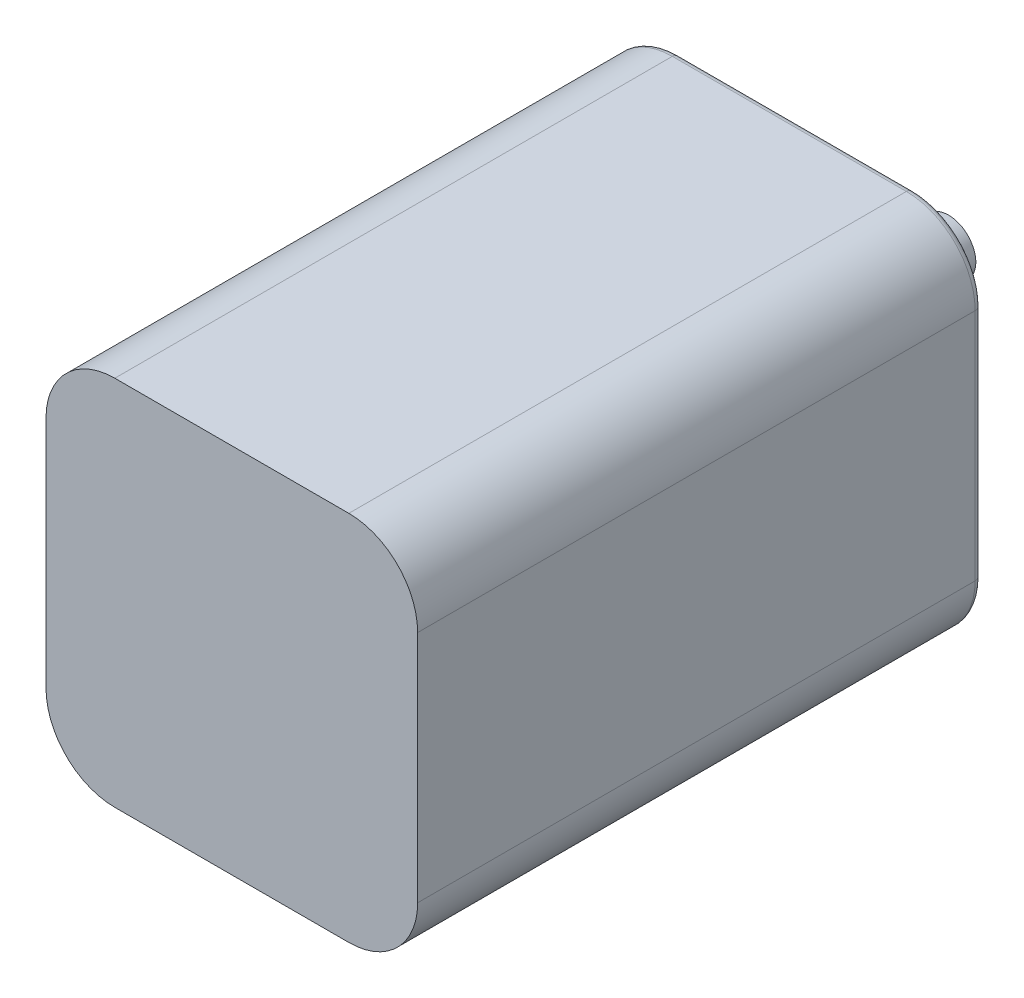
ISO-10303-21;
HEADER;
FILE_DESCRIPTION(('STEP AP214'),'2;1');
FILE_NAME('part.step','',(''),(''),'','','');
FILE_SCHEMA(('AUTOMOTIVE_DESIGN { 1 0 10303 214 1 1 1 1 }'));
ENDSEC;
DATA;
#1=APPLICATION_CONTEXT('core data for automotive mechanical design processes');
#2=APPLICATION_PROTOCOL_DEFINITION('international standard','automotive_design',2000,#1);
#3=PRODUCT_CONTEXT('',#1,'mechanical');
#4=PRODUCT('Part','Part','',(#3));
#5=PRODUCT_RELATED_PRODUCT_CATEGORY('part','',(#4));
#6=PRODUCT_DEFINITION_FORMATION('','',#4);
#7=PRODUCT_DEFINITION_CONTEXT('part definition',#1,'design');
#8=PRODUCT_DEFINITION('design','',#6,#7);
#9=PRODUCT_DEFINITION_SHAPE('','',#8);
#10=(LENGTH_UNIT() NAMED_UNIT(*) SI_UNIT(.MILLI.,.METRE.));
#11=(NAMED_UNIT(*) PLANE_ANGLE_UNIT() SI_UNIT($,.RADIAN.));
#12=(NAMED_UNIT(*) SI_UNIT($,.STERADIAN.) SOLID_ANGLE_UNIT());
#13=UNCERTAINTY_MEASURE_WITH_UNIT(LENGTH_MEASURE(1.E-05),#10,'distance_accuracy_value','');
#14=(GEOMETRIC_REPRESENTATION_CONTEXT(3) GLOBAL_UNCERTAINTY_ASSIGNED_CONTEXT((#13)) GLOBAL_UNIT_ASSIGNED_CONTEXT((#10,
#11,#12)) REPRESENTATION_CONTEXT('',''));
#15=CARTESIAN_POINT('',(0.,0.,0.));
#16=DIRECTION('',(0.,0.,1.));
#17=DIRECTION('',(1.,0.,0.));
#18=AXIS2_PLACEMENT_3D('',#15,#16,#17);
#19=CARTESIAN_POINT('',(34.29,-34.29,104.14));
#20=DIRECTION('',(-1.,0.,0.));
#21=DIRECTION('',(0.,0.,1.));
#22=AXIS2_PLACEMENT_3D('',#19,#20,#21);
#23=PLANE('',#22);
#24=DIRECTION('',(0.,0.,-1.));
#25=VECTOR('',#24,1.);
#26=CARTESIAN_POINT('',(34.29,-21.59,104.14));
#27=LINE('',#26,#25);
#28=CARTESIAN_POINT('',(34.29,-21.59,104.14));
#29=VERTEX_POINT('',#28);
#30=CARTESIAN_POINT('',(34.29,-21.59,1.26999999999999));
#31=VERTEX_POINT('',#30);
#32=EDGE_CURVE('E300',#29,#31,#27,.T.);
#33=ORIENTED_EDGE('',*,*,#32,.T.);
#34=DIRECTION('',(0.,1.,0.));
#35=VECTOR('',#34,1.);
#36=CARTESIAN_POINT('',(34.29,21.59,1.26999999999999));
#37=LINE('',#36,#35);
#38=CARTESIAN_POINT('',(34.29,21.59,1.26999999999999));
#39=VERTEX_POINT('',#38);
#40=EDGE_CURVE('E351',#31,#39,#37,.T.);
#41=ORIENTED_EDGE('',*,*,#40,.T.);
#42=DIRECTION('',(0.,0.,-1.));
#43=VECTOR('',#42,1.);
#44=CARTESIAN_POINT('',(34.29,21.59,104.14));
#45=LINE('',#44,#43);
#46=CARTESIAN_POINT('',(34.29,21.59,104.14));
#47=VERTEX_POINT('',#46);
#48=EDGE_CURVE('E303',#39,#47,#45,.F.);
#49=ORIENTED_EDGE('',*,*,#48,.T.);
#50=DIRECTION('',(0.,1.,0.));
#51=VECTOR('',#50,1.);
#52=CARTESIAN_POINT('',(34.29,-34.29,104.14));
#53=LINE('',#52,#51);
#54=EDGE_CURVE('E256',#29,#47,#53,.T.);
#55=ORIENTED_EDGE('',*,*,#54,.F.);
#56=EDGE_LOOP('',(#33,#41,#49,#55));
#57=FACE_BOUND('',#56,.T.);
#58=ADVANCED_FACE('F45',(#57),#23,.F.);
#59=CARTESIAN_POINT('',(-34.29,34.29,104.14));
#60=DIRECTION('',(0.,-1.,0.));
#61=DIRECTION('',(0.,0.,-1.));
#62=AXIS2_PLACEMENT_3D('',#59,#60,#61);
#63=PLANE('',#62);
#64=DIRECTION('',(0.,0.,-1.));
#65=VECTOR('',#64,1.);
#66=CARTESIAN_POINT('',(21.59,34.29,104.14));
#67=LINE('',#66,#65);
#68=CARTESIAN_POINT('',(21.59,34.29,104.14));
#69=VERTEX_POINT('',#68);
#70=CARTESIAN_POINT('',(21.59,34.29,1.26999999999999));
#71=VERTEX_POINT('',#70);
#72=EDGE_CURVE('E287',#69,#71,#67,.T.);
#73=ORIENTED_EDGE('',*,*,#72,.T.);
#74=DIRECTION('',(-1.,0.,0.));
#75=VECTOR('',#74,1.);
#76=CARTESIAN_POINT('',(-21.59,34.29,1.26999999999999));
#77=LINE('',#76,#75);
#78=CARTESIAN_POINT('',(-21.59,34.29,1.26999999999999));
#79=VERTEX_POINT('',#78);
#80=EDGE_CURVE('E355',#71,#79,#77,.T.);
#81=ORIENTED_EDGE('',*,*,#80,.T.);
#82=DIRECTION('',(0.,0.,-1.));
#83=VECTOR('',#82,1.);
#84=CARTESIAN_POINT('',(-21.59,34.29,104.14));
#85=LINE('',#84,#83);
#86=CARTESIAN_POINT('',(-21.59,34.29,104.14));
#87=VERTEX_POINT('',#86);
#88=EDGE_CURVE('E290',#79,#87,#85,.F.);
#89=ORIENTED_EDGE('',*,*,#88,.T.);
#90=DIRECTION('',(-1.,0.,0.));
#91=VECTOR('',#90,1.);
#92=CARTESIAN_POINT('',(-34.29,34.29,104.14));
#93=LINE('',#92,#91);
#94=EDGE_CURVE('E273',#69,#87,#93,.T.);
#95=ORIENTED_EDGE('',*,*,#94,.F.);
#96=EDGE_LOOP('',(#73,#81,#89,#95));
#97=FACE_BOUND('',#96,.T.);
#98=ADVANCED_FACE('F462',(#97),#63,.F.);
#99=CARTESIAN_POINT('',(-34.29,-34.29,104.14));
#100=DIRECTION('',(1.,0.,0.));
#101=DIRECTION('',(0.,0.,-1.));
#102=AXIS2_PLACEMENT_3D('',#99,#100,#101);
#103=PLANE('',#102);
#104=DIRECTION('',(0.,0.,-1.));
#105=VECTOR('',#104,1.);
#106=CARTESIAN_POINT('',(-34.29,21.59,104.14));
#107=LINE('',#106,#105);
#108=CARTESIAN_POINT('',(-34.29,21.59,104.14));
#109=VERTEX_POINT('',#108);
#110=CARTESIAN_POINT('',(-34.29,21.59,1.26999999999999));
#111=VERTEX_POINT('',#110);
#112=EDGE_CURVE('E284',#109,#111,#107,.T.);
#113=ORIENTED_EDGE('',*,*,#112,.T.);
#114=DIRECTION('',(0.,-1.,0.));
#115=VECTOR('',#114,1.);
#116=CARTESIAN_POINT('',(-34.29,-21.59,1.26999999999999));
#117=LINE('',#116,#115);
#118=CARTESIAN_POINT('',(-34.29,-21.59,1.26999999999999));
#119=VERTEX_POINT('',#118);
#120=EDGE_CURVE('E359',#111,#119,#117,.T.);
#121=ORIENTED_EDGE('',*,*,#120,.T.);
#122=DIRECTION('',(0.,0.,-1.));
#123=VECTOR('',#122,1.);
#124=CARTESIAN_POINT('',(-34.29,-21.59,104.14));
#125=LINE('',#124,#123);
#126=CARTESIAN_POINT('',(-34.29,-21.59,104.14));
#127=VERTEX_POINT('',#126);
#128=EDGE_CURVE('E282',#119,#127,#125,.F.);
#129=ORIENTED_EDGE('',*,*,#128,.T.);
#130=DIRECTION('',(0.,-1.,0.));
#131=VECTOR('',#130,1.);
#132=CARTESIAN_POINT('',(-34.29,-34.29,104.14));
#133=LINE('',#132,#131);
#134=EDGE_CURVE('E276',#109,#127,#133,.T.);
#135=ORIENTED_EDGE('',*,*,#134,.F.);
#136=EDGE_LOOP('',(#113,#121,#129,#135));
#137=FACE_BOUND('',#136,.T.);
#138=ADVANCED_FACE('F469',(#137),#103,.F.);
#139=CARTESIAN_POINT('',(-34.29,-34.29,104.14));
#140=DIRECTION('',(0.,1.,0.));
#141=DIRECTION('',(0.,0.,1.));
#142=AXIS2_PLACEMENT_3D('',#139,#140,#141);
#143=PLANE('',#142);
#144=DIRECTION('',(0.,0.,-1.));
#145=VECTOR('',#144,1.);
#146=CARTESIAN_POINT('',(-21.59,-34.29,104.14));
#147=LINE('',#146,#145);
#148=CARTESIAN_POINT('',(-21.59,-34.29,104.14));
#149=VERTEX_POINT('',#148);
#150=CARTESIAN_POINT('',(-21.59,-34.29,1.26999999999999));
#151=VERTEX_POINT('',#150);
#152=EDGE_CURVE('E305',#149,#151,#147,.T.);
#153=ORIENTED_EDGE('',*,*,#152,.T.);
#154=DIRECTION('',(1.,0.,0.));
#155=VECTOR('',#154,1.);
#156=CARTESIAN_POINT('',(21.59,-34.29,1.26999999999999));
#157=LINE('',#156,#155);
#158=CARTESIAN_POINT('',(21.59,-34.29,1.26999999999999));
#159=VERTEX_POINT('',#158);
#160=EDGE_CURVE('E347',#151,#159,#157,.T.);
#161=ORIENTED_EDGE('',*,*,#160,.T.);
#162=DIRECTION('',(0.,0.,-1.));
#163=VECTOR('',#162,1.);
#164=CARTESIAN_POINT('',(21.59,-34.29,104.14));
#165=LINE('',#164,#163);
#166=CARTESIAN_POINT('',(21.59,-34.29,104.14));
#167=VERTEX_POINT('',#166);
#168=EDGE_CURVE('E308',#159,#167,#165,.F.);
#169=ORIENTED_EDGE('',*,*,#168,.T.);
#170=DIRECTION('',(1.,0.,0.));
#171=VECTOR('',#170,1.);
#172=CARTESIAN_POINT('',(-34.29,-34.29,104.14));
#173=LINE('',#172,#171);
#174=EDGE_CURVE('E279',#149,#167,#173,.T.);
#175=ORIENTED_EDGE('',*,*,#174,.F.);
#176=EDGE_LOOP('',(#153,#161,#169,#175));
#177=FACE_BOUND('',#176,.T.);
#178=ADVANCED_FACE('F681',(#177),#143,.F.);
#179=CARTESIAN_POINT('',(0.,0.,104.14));
#180=DIRECTION('',(0.,0.,-1.));
#181=DIRECTION('',(-1.,0.,0.));
#182=AXIS2_PLACEMENT_3D('',#179,#180,#181);
#183=PLANE('',#182);
#184=ORIENTED_EDGE('',*,*,#94,.T.);
#185=CARTESIAN_POINT('',(-21.59,21.59,104.14));
#186=DIRECTION('',(0.,0.,-1.));
#187=DIRECTION('',(-1.,0.,0.));
#188=AXIS2_PLACEMENT_3D('',#185,#186,#187);
#189=CIRCLE('',#188,12.7);
#190=EDGE_CURVE('E298',#87,#109,#189,.F.);
#191=ORIENTED_EDGE('',*,*,#190,.T.);
#192=ORIENTED_EDGE('',*,*,#134,.T.);
#193=CARTESIAN_POINT('',(-21.59,-21.59,104.14));
#194=DIRECTION('',(0.,0.,-1.));
#195=DIRECTION('',(-1.,0.,0.));
#196=AXIS2_PLACEMENT_3D('',#193,#194,#195);
#197=CIRCLE('',#196,12.7);
#198=EDGE_CURVE('E292',#127,#149,#197,.F.);
#199=ORIENTED_EDGE('',*,*,#198,.T.);
#200=ORIENTED_EDGE('',*,*,#174,.T.);
#201=CARTESIAN_POINT('',(21.59,-21.59,104.14));
#202=DIRECTION('',(0.,0.,-1.));
#203=DIRECTION('',(-1.,0.,0.));
#204=AXIS2_PLACEMENT_3D('',#201,#202,#203);
#205=CIRCLE('',#204,12.7);
#206=EDGE_CURVE('E294',#167,#29,#205,.F.);
#207=ORIENTED_EDGE('',*,*,#206,.T.);
#208=ORIENTED_EDGE('',*,*,#54,.T.);
#209=CARTESIAN_POINT('',(21.59,21.59,104.14));
#210=DIRECTION('',(0.,0.,-1.));
#211=DIRECTION('',(-1.,0.,0.));
#212=AXIS2_PLACEMENT_3D('',#209,#210,#211);
#213=CIRCLE('',#212,12.7);
#214=EDGE_CURVE('E296',#47,#69,#213,.F.);
#215=ORIENTED_EDGE('',*,*,#214,.T.);
#216=EDGE_LOOP('',(#184,#191,#192,#199,#200,#207,#208,#215));
#217=FACE_BOUND('',#216,.T.);
#218=ADVANCED_FACE('F671',(#217),#183,.F.);
#219=CARTESIAN_POINT('',(0.,0.,0.));
#220=DIRECTION('',(0.,0.,-1.));
#221=DIRECTION('',(-1.,0.,0.));
#222=AXIS2_PLACEMENT_3D('',#219,#220,#221);
#223=PLANE('',#222);
#224=DIRECTION('',(1.,0.,0.));
#225=VECTOR('',#224,1.);
#226=CARTESIAN_POINT('',(-21.59,-33.02,0.));
#227=LINE('',#226,#225);
#228=CARTESIAN_POINT('',(21.59,-33.02,0.));
#229=VERTEX_POINT('',#228);
#230=CARTESIAN_POINT('',(-21.59,-33.02,0.));
#231=VERTEX_POINT('',#230);
#232=EDGE_CURVE('E339',#229,#231,#227,.F.);
#233=ORIENTED_EDGE('',*,*,#232,.T.);
#234=CARTESIAN_POINT('',(-21.59,-21.59,0.));
#235=DIRECTION('',(0.,0.,-1.));
#236=DIRECTION('',(-1.,0.,0.));
#237=AXIS2_PLACEMENT_3D('',#234,#235,#236);
#238=CIRCLE('',#237,11.43);
#239=CARTESIAN_POINT('',(-33.02,-21.59,0.));
#240=VERTEX_POINT('',#239);
#241=EDGE_CURVE('E341',#231,#240,#238,.T.);
#242=ORIENTED_EDGE('',*,*,#241,.T.);
#243=DIRECTION('',(0.,-1.,0.));
#244=VECTOR('',#243,1.);
#245=CARTESIAN_POINT('',(-33.02,21.59,0.));
#246=LINE('',#245,#244);
#247=CARTESIAN_POINT('',(-33.02,21.59,0.));
#248=VERTEX_POINT('',#247);
#249=EDGE_CURVE('E327',#240,#248,#246,.F.);
#250=ORIENTED_EDGE('',*,*,#249,.T.);
#251=CARTESIAN_POINT('',(-21.59,21.59,0.));
#252=DIRECTION('',(0.,0.,-1.));
#253=DIRECTION('',(-1.,0.,0.));
#254=AXIS2_PLACEMENT_3D('',#251,#252,#253);
#255=CIRCLE('',#254,11.43);
#256=CARTESIAN_POINT('',(-21.59,33.02,0.));
#257=VERTEX_POINT('',#256);
#258=EDGE_CURVE('E329',#248,#257,#255,.T.);
#259=ORIENTED_EDGE('',*,*,#258,.T.);
#260=DIRECTION('',(-1.,0.,0.));
#261=VECTOR('',#260,1.);
#262=CARTESIAN_POINT('',(21.59,33.02,0.));
#263=LINE('',#262,#261);
#264=CARTESIAN_POINT('',(21.59,33.02,0.));
#265=VERTEX_POINT('',#264);
#266=EDGE_CURVE('E331',#257,#265,#263,.F.);
#267=ORIENTED_EDGE('',*,*,#266,.T.);
#268=CARTESIAN_POINT('',(21.59,21.59,0.));
#269=DIRECTION('',(0.,0.,-1.));
#270=DIRECTION('',(-1.,0.,0.));
#271=AXIS2_PLACEMENT_3D('',#268,#269,#270);
#272=CIRCLE('',#271,11.43);
#273=CARTESIAN_POINT('',(33.02,21.59,0.));
#274=VERTEX_POINT('',#273);
#275=EDGE_CURVE('E333',#265,#274,#272,.T.);
#276=ORIENTED_EDGE('',*,*,#275,.T.);
#277=DIRECTION('',(0.,1.,0.));
#278=VECTOR('',#277,1.);
#279=CARTESIAN_POINT('',(33.02,-21.59,0.));
#280=LINE('',#279,#278);
#281=CARTESIAN_POINT('',(33.02,-21.59,0.));
#282=VERTEX_POINT('',#281);
#283=EDGE_CURVE('E335',#274,#282,#280,.F.);
#284=ORIENTED_EDGE('',*,*,#283,.T.);
#285=CARTESIAN_POINT('',(21.59,-21.59,0.));
#286=DIRECTION('',(0.,0.,-1.));
#287=DIRECTION('',(-1.,0.,0.));
#288=AXIS2_PLACEMENT_3D('',#285,#286,#287);
#289=CIRCLE('',#288,11.43);
#290=EDGE_CURVE('E337',#282,#229,#289,.T.);
#291=ORIENTED_EDGE('',*,*,#290,.T.);
#292=EDGE_LOOP('',(#233,#242,#250,#259,#267,#276,#284,#291));
#293=FACE_BOUND('',#292,.T.);
#294=CARTESIAN_POINT('',(-21.59,21.59,0.));
#295=DIRECTION('',(0.,0.,-1.));
#296=DIRECTION('',(-1.,0.,0.));
#297=AXIS2_PLACEMENT_3D('',#294,#295,#296);
#298=CIRCLE('',#297,10.16);
#299=CARTESIAN_POINT('',(-21.59,31.75,0.));
#300=VERTEX_POINT('',#299);
#301=CARTESIAN_POINT('',(-31.75,21.59,0.));
#302=VERTEX_POINT('',#301);
#303=EDGE_CURVE('E322',#300,#302,#298,.F.);
#304=ORIENTED_EDGE('',*,*,#303,.T.);
#305=DIRECTION('',(0.,1.,0.));
#306=VECTOR('',#305,1.);
#307=CARTESIAN_POINT('',(-31.75,-21.59,0.));
#308=LINE('',#307,#306);
#309=CARTESIAN_POINT('',(-31.75,-21.59,0.));
#310=VERTEX_POINT('',#309);
#311=EDGE_CURVE('E324',#302,#310,#308,.F.);
#312=ORIENTED_EDGE('',*,*,#311,.T.);
#313=CARTESIAN_POINT('',(-21.59,-21.59,0.));
#314=DIRECTION('',(0.,0.,-1.));
#315=DIRECTION('',(-1.,0.,0.));
#316=AXIS2_PLACEMENT_3D('',#313,#314,#315);
#317=CIRCLE('',#316,10.16);
#318=CARTESIAN_POINT('',(-21.59,-31.75,0.));
#319=VERTEX_POINT('',#318);
#320=EDGE_CURVE('E310',#310,#319,#317,.F.);
#321=ORIENTED_EDGE('',*,*,#320,.T.);
#322=DIRECTION('',(-1.,0.,0.));
#323=VECTOR('',#322,1.);
#324=CARTESIAN_POINT('',(21.59,-31.75,0.));
#325=LINE('',#324,#323);
#326=CARTESIAN_POINT('',(21.59,-31.75,0.));
#327=VERTEX_POINT('',#326);
#328=EDGE_CURVE('E312',#319,#327,#325,.F.);
#329=ORIENTED_EDGE('',*,*,#328,.T.);
#330=CARTESIAN_POINT('',(21.59,-21.59,0.));
#331=DIRECTION('',(0.,0.,-1.));
#332=DIRECTION('',(-1.,0.,0.));
#333=AXIS2_PLACEMENT_3D('',#330,#331,#332);
#334=CIRCLE('',#333,10.16);
#335=CARTESIAN_POINT('',(31.75,-21.59,0.));
#336=VERTEX_POINT('',#335);
#337=EDGE_CURVE('E314',#327,#336,#334,.F.);
#338=ORIENTED_EDGE('',*,*,#337,.T.);
#339=DIRECTION('',(0.,-1.,0.));
#340=VECTOR('',#339,1.);
#341=CARTESIAN_POINT('',(31.75,21.59,0.));
#342=LINE('',#341,#340);
#343=CARTESIAN_POINT('',(31.75,21.59,0.));
#344=VERTEX_POINT('',#343);
#345=EDGE_CURVE('E316',#336,#344,#342,.F.);
#346=ORIENTED_EDGE('',*,*,#345,.T.);
#347=CARTESIAN_POINT('',(21.59,21.59,0.));
#348=DIRECTION('',(0.,0.,-1.));
#349=DIRECTION('',(-1.,0.,0.));
#350=AXIS2_PLACEMENT_3D('',#347,#348,#349);
#351=CIRCLE('',#350,10.16);
#352=CARTESIAN_POINT('',(21.59,31.75,0.));
#353=VERTEX_POINT('',#352);
#354=EDGE_CURVE('E318',#344,#353,#351,.F.);
#355=ORIENTED_EDGE('',*,*,#354,.T.);
#356=DIRECTION('',(1.,0.,0.));
#357=VECTOR('',#356,1.);
#358=CARTESIAN_POINT('',(-21.59,31.75,0.));
#359=LINE('',#358,#357);
#360=EDGE_CURVE('E320',#353,#300,#359,.F.);
#361=ORIENTED_EDGE('',*,*,#360,.T.);
#362=EDGE_LOOP('',(#304,#312,#321,#329,#338,#346,#355,#361));
#363=FACE_BOUND('',#362,.T.);
#364=ADVANCED_FACE('F423',(#293,#363),#223,.T.);
#365=CARTESIAN_POINT('',(-21.59,21.59,104.14));
#366=DIRECTION('',(0.,0.,-1.));
#367=DIRECTION('',(-1.,0.,0.));
#368=AXIS2_PLACEMENT_3D('',#365,#366,#367);
#369=CYLINDRICAL_SURFACE('',#368,12.7);
#370=ORIENTED_EDGE('',*,*,#88,.F.);
#371=CARTESIAN_POINT('',(-21.59,21.59,1.26999999999999));
#372=DIRECTION('',(0.,0.,-1.));
#373=DIRECTION('',(-1.,0.,0.));
#374=AXIS2_PLACEMENT_3D('',#371,#372,#373);
#375=CIRCLE('',#374,12.7);
#376=EDGE_CURVE('E357',#79,#111,#375,.F.);
#377=ORIENTED_EDGE('',*,*,#376,.T.);
#378=ORIENTED_EDGE('',*,*,#112,.F.);
#379=ORIENTED_EDGE('',*,*,#190,.F.);
#380=EDGE_LOOP('',(#370,#377,#378,#379));
#381=FACE_BOUND('',#380,.T.);
#382=ADVANCED_FACE('F474',(#381),#369,.T.);
#383=CARTESIAN_POINT('',(21.59,21.59,104.14));
#384=DIRECTION('',(0.,0.,-1.));
#385=DIRECTION('',(-1.,0.,0.));
#386=AXIS2_PLACEMENT_3D('',#383,#384,#385);
#387=CYLINDRICAL_SURFACE('',#386,12.7);
#388=ORIENTED_EDGE('',*,*,#48,.F.);
#389=CARTESIAN_POINT('',(21.59,21.59,1.26999999999999));
#390=DIRECTION('',(0.,0.,-1.));
#391=DIRECTION('',(-1.,0.,0.));
#392=AXIS2_PLACEMENT_3D('',#389,#390,#391);
#393=CIRCLE('',#392,12.7);
#394=EDGE_CURVE('E353',#39,#71,#393,.F.);
#395=ORIENTED_EDGE('',*,*,#394,.T.);
#396=ORIENTED_EDGE('',*,*,#72,.F.);
#397=ORIENTED_EDGE('',*,*,#214,.F.);
#398=EDGE_LOOP('',(#388,#395,#396,#397));
#399=FACE_BOUND('',#398,.T.);
#400=ADVANCED_FACE('F477',(#399),#387,.T.);
#401=CARTESIAN_POINT('',(21.59,-21.59,104.14));
#402=DIRECTION('',(0.,0.,-1.));
#403=DIRECTION('',(-1.,0.,0.));
#404=AXIS2_PLACEMENT_3D('',#401,#402,#403);
#405=CYLINDRICAL_SURFACE('',#404,12.7);
#406=ORIENTED_EDGE('',*,*,#168,.F.);
#407=CARTESIAN_POINT('',(21.59,-21.59,1.26999999999999));
#408=DIRECTION('',(0.,0.,-1.));
#409=DIRECTION('',(-1.,0.,0.));
#410=AXIS2_PLACEMENT_3D('',#407,#408,#409);
#411=CIRCLE('',#410,12.7);
#412=EDGE_CURVE('E349',#159,#31,#411,.F.);
#413=ORIENTED_EDGE('',*,*,#412,.T.);
#414=ORIENTED_EDGE('',*,*,#32,.F.);
#415=ORIENTED_EDGE('',*,*,#206,.F.);
#416=EDGE_LOOP('',(#406,#413,#414,#415));
#417=FACE_BOUND('',#416,.T.);
#418=ADVANCED_FACE('F481',(#417),#405,.T.);
#419=CARTESIAN_POINT('',(-21.59,-21.59,104.14));
#420=DIRECTION('',(0.,0.,-1.));
#421=DIRECTION('',(-1.,0.,0.));
#422=AXIS2_PLACEMENT_3D('',#419,#420,#421);
#423=CYLINDRICAL_SURFACE('',#422,12.7);
#424=ORIENTED_EDGE('',*,*,#128,.F.);
#425=CARTESIAN_POINT('',(-21.59,-21.59,1.26999999999999));
#426=DIRECTION('',(0.,0.,-1.));
#427=DIRECTION('',(-1.,0.,0.));
#428=AXIS2_PLACEMENT_3D('',#425,#426,#427);
#429=CIRCLE('',#428,12.7);
#430=EDGE_CURVE('E344',#119,#151,#429,.F.);
#431=ORIENTED_EDGE('',*,*,#430,.T.);
#432=ORIENTED_EDGE('',*,*,#152,.F.);
#433=ORIENTED_EDGE('',*,*,#198,.F.);
#434=EDGE_LOOP('',(#424,#431,#432,#433));
#435=FACE_BOUND('',#434,.T.);
#436=ADVANCED_FACE('F485',(#435),#423,.T.);
#437=CARTESIAN_POINT('',(-21.59,-21.59,5.08));
#438=DIRECTION('',(0.,0.,-1.));
#439=DIRECTION('',(-1.,0.,0.));
#440=AXIS2_PLACEMENT_3D('',#437,#438,#439);
#441=CYLINDRICAL_SURFACE('',#440,8.89);
#442=DIRECTION('',(0.,0.,-1.));
#443=VECTOR('',#442,1.);
#444=CARTESIAN_POINT('',(-21.59,-30.48,5.08));
#445=LINE('',#444,#443);
#446=CARTESIAN_POINT('',(-21.59,-30.48,5.08));
#447=VERTEX_POINT('',#446);
#448=CARTESIAN_POINT('',(-21.59,-30.48,1.27));
#449=VERTEX_POINT('',#448);
#450=EDGE_CURVE('E254',#447,#449,#445,.T.);
#451=ORIENTED_EDGE('',*,*,#450,.T.);
#452=CARTESIAN_POINT('',(-21.59,-21.59,1.27));
#453=DIRECTION('',(0.,0.,-1.));
#454=DIRECTION('',(-1.,0.,0.));
#455=AXIS2_PLACEMENT_3D('',#452,#453,#454);
#456=CIRCLE('',#455,8.89);
#457=CARTESIAN_POINT('',(-30.48,-21.59,1.27));
#458=VERTEX_POINT('',#457);
#459=EDGE_CURVE('E11',#449,#458,#456,.T.);
#460=ORIENTED_EDGE('',*,*,#459,.T.);
#461=DIRECTION('',(0.,0.,-1.));
#462=VECTOR('',#461,1.);
#463=CARTESIAN_POINT('',(-30.48,-21.59,5.08));
#464=LINE('',#463,#462);
#465=CARTESIAN_POINT('',(-30.48,-21.59,5.08));
#466=VERTEX_POINT('',#465);
#467=EDGE_CURVE('E207',#466,#458,#464,.T.);
#468=ORIENTED_EDGE('',*,*,#467,.F.);
#469=CARTESIAN_POINT('',(-21.59,-21.59,5.08));
#470=DIRECTION('',(0.,0.,-1.));
#471=DIRECTION('',(-1.,0.,0.));
#472=AXIS2_PLACEMENT_3D('',#469,#470,#471);
#473=CIRCLE('',#472,8.89);
#474=EDGE_CURVE('E211',#447,#466,#473,.T.);
#475=ORIENTED_EDGE('',*,*,#474,.F.);
#476=EDGE_LOOP('',(#451,#460,#468,#475));
#477=FACE_BOUND('',#476,.T.);
#478=ADVANCED_FACE('F209',(#477),#441,.F.);
#479=CARTESIAN_POINT('',(21.59,-30.48,5.08));
#480=DIRECTION('',(0.,-1.,0.));
#481=DIRECTION('',(0.,0.,-1.));
#482=AXIS2_PLACEMENT_3D('',#479,#480,#481);
#483=PLANE('',#482);
#484=DIRECTION('',(0.,0.,-1.));
#485=VECTOR('',#484,1.);
#486=CARTESIAN_POINT('',(21.59,-30.48,5.08));
#487=LINE('',#486,#485);
#488=CARTESIAN_POINT('',(21.59,-30.48,5.08));
#489=VERTEX_POINT('',#488);
#490=CARTESIAN_POINT('',(21.59,-30.48,1.27));
#491=VERTEX_POINT('',#490);
#492=EDGE_CURVE('E257',#489,#491,#487,.T.);
#493=ORIENTED_EDGE('',*,*,#492,.T.);
#494=DIRECTION('',(-1.,0.,0.));
#495=VECTOR('',#494,1.);
#496=CARTESIAN_POINT('',(-21.59,-30.48,1.27));
#497=LINE('',#496,#495);
#498=EDGE_CURVE('E54',#491,#449,#497,.T.);
#499=ORIENTED_EDGE('',*,*,#498,.T.);
#500=ORIENTED_EDGE('',*,*,#450,.F.);
#501=DIRECTION('',(-1.,0.,0.));
#502=VECTOR('',#501,1.);
#503=CARTESIAN_POINT('',(21.59,-30.48,5.08));
#504=LINE('',#503,#502);
#505=EDGE_CURVE('E218',#489,#447,#504,.T.);
#506=ORIENTED_EDGE('',*,*,#505,.F.);
#507=EDGE_LOOP('',(#493,#499,#500,#506));
#508=FACE_BOUND('',#507,.T.);
#509=ADVANCED_FACE('F451',(#508),#483,.F.);
#510=CARTESIAN_POINT('',(21.59,-21.59,5.08));
#511=DIRECTION('',(0.,0.,-1.));
#512=DIRECTION('',(-1.,0.,0.));
#513=AXIS2_PLACEMENT_3D('',#510,#511,#512);
#514=CYLINDRICAL_SURFACE('',#513,8.89);
#515=DIRECTION('',(0.,0.,-1.));
#516=VECTOR('',#515,1.);
#517=CARTESIAN_POINT('',(30.48,-21.59,5.08));
#518=LINE('',#517,#516);
#519=CARTESIAN_POINT('',(30.48,-21.59,5.08));
#520=VERTEX_POINT('',#519);
#521=CARTESIAN_POINT('',(30.48,-21.59,1.27));
#522=VERTEX_POINT('',#521);
#523=EDGE_CURVE('E259',#520,#522,#518,.T.);
#524=ORIENTED_EDGE('',*,*,#523,.T.);
#525=CARTESIAN_POINT('',(21.59,-21.59,1.27));
#526=DIRECTION('',(0.,0.,-1.));
#527=DIRECTION('',(-1.,0.,0.));
#528=AXIS2_PLACEMENT_3D('',#525,#526,#527);
#529=CIRCLE('',#528,8.89);
#530=EDGE_CURVE('E69',#522,#491,#529,.T.);
#531=ORIENTED_EDGE('',*,*,#530,.T.);
#532=ORIENTED_EDGE('',*,*,#492,.F.);
#533=CARTESIAN_POINT('',(21.59,-21.59,5.08));
#534=DIRECTION('',(0.,0.,-1.));
#535=DIRECTION('',(-1.,0.,0.));
#536=AXIS2_PLACEMENT_3D('',#533,#534,#535);
#537=CIRCLE('',#536,8.89);
#538=EDGE_CURVE('E251',#520,#489,#537,.T.);
#539=ORIENTED_EDGE('',*,*,#538,.F.);
#540=EDGE_LOOP('',(#524,#531,#532,#539));
#541=FACE_BOUND('',#540,.T.);
#542=ADVANCED_FACE('F452',(#541),#514,.F.);
#543=CARTESIAN_POINT('',(30.48,21.59,5.08));
#544=DIRECTION('',(1.,0.,0.));
#545=DIRECTION('',(0.,0.,-1.));
#546=AXIS2_PLACEMENT_3D('',#543,#544,#545);
#547=PLANE('',#546);
#548=DIRECTION('',(0.,0.,-1.));
#549=VECTOR('',#548,1.);
#550=CARTESIAN_POINT('',(30.48,21.59,5.08));
#551=LINE('',#550,#549);
#552=CARTESIAN_POINT('',(30.48,21.59,5.08));
#553=VERTEX_POINT('',#552);
#554=CARTESIAN_POINT('',(30.48,21.59,1.27));
#555=VERTEX_POINT('',#554);
#556=EDGE_CURVE('E261',#553,#555,#551,.T.);
#557=ORIENTED_EDGE('',*,*,#556,.T.);
#558=DIRECTION('',(0.,-1.,0.));
#559=VECTOR('',#558,1.);
#560=CARTESIAN_POINT('',(30.48,-21.59,1.27));
#561=LINE('',#560,#559);
#562=EDGE_CURVE('E369',#555,#522,#561,.T.);
#563=ORIENTED_EDGE('',*,*,#562,.T.);
#564=ORIENTED_EDGE('',*,*,#523,.F.);
#565=DIRECTION('',(0.,-1.,0.));
#566=VECTOR('',#565,1.);
#567=CARTESIAN_POINT('',(30.48,21.59,5.08));
#568=LINE('',#567,#566);
#569=EDGE_CURVE('E248',#553,#520,#568,.T.);
#570=ORIENTED_EDGE('',*,*,#569,.F.);
#571=EDGE_LOOP('',(#557,#563,#564,#570));
#572=FACE_BOUND('',#571,.T.);
#573=ADVANCED_FACE('F449',(#572),#547,.F.);
#574=CARTESIAN_POINT('',(21.59,21.59,5.08));
#575=DIRECTION('',(0.,0.,-1.));
#576=DIRECTION('',(-1.,0.,0.));
#577=AXIS2_PLACEMENT_3D('',#574,#575,#576);
#578=CYLINDRICAL_SURFACE('',#577,8.89);
#579=DIRECTION('',(0.,0.,-1.));
#580=VECTOR('',#579,1.);
#581=CARTESIAN_POINT('',(21.59,30.48,5.08));
#582=LINE('',#581,#580);
#583=CARTESIAN_POINT('',(21.59,30.48,5.08));
#584=VERTEX_POINT('',#583);
#585=CARTESIAN_POINT('',(21.59,30.48,1.27));
#586=VERTEX_POINT('',#585);
#587=EDGE_CURVE('E264',#584,#586,#582,.T.);
#588=ORIENTED_EDGE('',*,*,#587,.T.);
#589=CARTESIAN_POINT('',(21.59,21.59,1.27));
#590=DIRECTION('',(0.,0.,-1.));
#591=DIRECTION('',(-1.,0.,0.));
#592=AXIS2_PLACEMENT_3D('',#589,#590,#591);
#593=CIRCLE('',#592,8.89);
#594=EDGE_CURVE('E367',#586,#555,#593,.T.);
#595=ORIENTED_EDGE('',*,*,#594,.T.);
#596=ORIENTED_EDGE('',*,*,#556,.F.);
#597=CARTESIAN_POINT('',(21.59,21.59,5.08));
#598=DIRECTION('',(0.,0.,-1.));
#599=DIRECTION('',(-1.,0.,0.));
#600=AXIS2_PLACEMENT_3D('',#597,#598,#599);
#601=CIRCLE('',#600,8.89);
#602=EDGE_CURVE('E245',#584,#553,#601,.T.);
#603=ORIENTED_EDGE('',*,*,#602,.F.);
#604=EDGE_LOOP('',(#588,#595,#596,#603));
#605=FACE_BOUND('',#604,.T.);
#606=ADVANCED_FACE('F446',(#605),#578,.F.);
#607=CARTESIAN_POINT('',(-21.59,30.48,5.08));
#608=DIRECTION('',(0.,1.,0.));
#609=DIRECTION('',(0.,0.,1.));
#610=AXIS2_PLACEMENT_3D('',#607,#608,#609);
#611=PLANE('',#610);
#612=DIRECTION('',(0.,0.,-1.));
#613=VECTOR('',#612,1.);
#614=CARTESIAN_POINT('',(-21.59,30.48,5.08));
#615=LINE('',#614,#613);
#616=CARTESIAN_POINT('',(-21.59,30.48,5.08));
#617=VERTEX_POINT('',#616);
#618=CARTESIAN_POINT('',(-21.59,30.48,1.27));
#619=VERTEX_POINT('',#618);
#620=EDGE_CURVE('E267',#617,#619,#615,.T.);
#621=ORIENTED_EDGE('',*,*,#620,.T.);
#622=DIRECTION('',(1.,0.,0.));
#623=VECTOR('',#622,1.);
#624=CARTESIAN_POINT('',(21.59,30.48,1.27));
#625=LINE('',#624,#623);
#626=EDGE_CURVE('E365',#619,#586,#625,.T.);
#627=ORIENTED_EDGE('',*,*,#626,.T.);
#628=ORIENTED_EDGE('',*,*,#587,.F.);
#629=DIRECTION('',(1.,0.,0.));
#630=VECTOR('',#629,1.);
#631=CARTESIAN_POINT('',(-21.59,30.48,5.08));
#632=LINE('',#631,#630);
#633=EDGE_CURVE('E242',#617,#584,#632,.T.);
#634=ORIENTED_EDGE('',*,*,#633,.F.);
#635=EDGE_LOOP('',(#621,#627,#628,#634));
#636=FACE_BOUND('',#635,.T.);
#637=ADVANCED_FACE('F443',(#636),#611,.F.);
#638=CARTESIAN_POINT('',(-21.59,21.59,5.08));
#639=DIRECTION('',(0.,0.,-1.));
#640=DIRECTION('',(-1.,0.,0.));
#641=AXIS2_PLACEMENT_3D('',#638,#639,#640);
#642=CYLINDRICAL_SURFACE('',#641,8.89);
#643=DIRECTION('',(0.,0.,-1.));
#644=VECTOR('',#643,1.);
#645=CARTESIAN_POINT('',(-30.48,21.59,5.08));
#646=LINE('',#645,#644);
#647=CARTESIAN_POINT('',(-30.48,21.59,5.08));
#648=VERTEX_POINT('',#647);
#649=CARTESIAN_POINT('',(-30.48,21.59,1.27));
#650=VERTEX_POINT('',#649);
#651=EDGE_CURVE('E217',#648,#650,#646,.T.);
#652=ORIENTED_EDGE('',*,*,#651,.T.);
#653=CARTESIAN_POINT('',(-21.59,21.59,1.27));
#654=DIRECTION('',(0.,0.,-1.));
#655=DIRECTION('',(-1.,0.,0.));
#656=AXIS2_PLACEMENT_3D('',#653,#654,#655);
#657=CIRCLE('',#656,8.89);
#658=EDGE_CURVE('E363',#650,#619,#657,.T.);
#659=ORIENTED_EDGE('',*,*,#658,.T.);
#660=ORIENTED_EDGE('',*,*,#620,.F.);
#661=CARTESIAN_POINT('',(-21.59,21.59,5.08));
#662=DIRECTION('',(0.,0.,-1.));
#663=DIRECTION('',(-1.,0.,0.));
#664=AXIS2_PLACEMENT_3D('',#661,#662,#663);
#665=CIRCLE('',#664,8.89);
#666=EDGE_CURVE('E227',#648,#617,#665,.T.);
#667=ORIENTED_EDGE('',*,*,#666,.F.);
#668=EDGE_LOOP('',(#652,#659,#660,#667));
#669=FACE_BOUND('',#668,.T.);
#670=ADVANCED_FACE('F439',(#669),#642,.F.);
#671=CARTESIAN_POINT('',(-30.48,-21.59,5.08));
#672=DIRECTION('',(-1.,0.,0.));
#673=DIRECTION('',(0.,0.,1.));
#674=AXIS2_PLACEMENT_3D('',#671,#672,#673);
#675=PLANE('',#674);
#676=ORIENTED_EDGE('',*,*,#467,.T.);
#677=DIRECTION('',(0.,1.,0.));
#678=VECTOR('',#677,1.);
#679=CARTESIAN_POINT('',(-30.48,21.59,1.27));
#680=LINE('',#679,#678);
#681=EDGE_CURVE('E361',#458,#650,#680,.T.);
#682=ORIENTED_EDGE('',*,*,#681,.T.);
#683=ORIENTED_EDGE('',*,*,#651,.F.);
#684=DIRECTION('',(0.,1.,0.));
#685=VECTOR('',#684,1.);
#686=CARTESIAN_POINT('',(-30.48,-21.59,5.08));
#687=LINE('',#686,#685);
#688=EDGE_CURVE('E221',#466,#648,#687,.T.);
#689=ORIENTED_EDGE('',*,*,#688,.F.);
#690=EDGE_LOOP('',(#676,#682,#683,#689));
#691=FACE_BOUND('',#690,.T.);
#692=ADVANCED_FACE('F222',(#691),#675,.F.);
#693=CARTESIAN_POINT('',(-21.59,-21.59,5.08));
#694=DIRECTION('',(0.,0.,-1.));
#695=DIRECTION('',(-1.,0.,0.));
#696=AXIS2_PLACEMENT_3D('',#693,#694,#695);
#697=PLANE('',#696);
#698=CARTESIAN_POINT('',(0.,0.,5.08));
#699=DIRECTION('',(0.,0.,-1.));
#700=DIRECTION('',(-1.,0.,0.));
#701=AXIS2_PLACEMENT_3D('',#698,#699,#700);
#702=CIRCLE('',#701,6.35);
#703=CARTESIAN_POINT('',(-6.35,0.,5.08));
#704=VERTEX_POINT('',#703);
#705=EDGE_CURVE('E853',#704,#704,#702,.T.);
#706=ORIENTED_EDGE('',*,*,#705,.F.);
#707=EDGE_LOOP('',(#706));
#708=FACE_BOUND('',#707,.T.);
#709=CARTESIAN_POINT('',(17.9605122421382,17.9605122421384,5.08));
#710=DIRECTION('',(0.,0.,-1.));
#711=DIRECTION('',(-1.,0.,0.));
#712=AXIS2_PLACEMENT_3D('',#709,#710,#711);
#713=CIRCLE('',#712,6.35);
#714=CARTESIAN_POINT('',(11.6105122421382,17.9605122421384,5.08));
#715=VERTEX_POINT('',#714);
#716=EDGE_CURVE('E238',#715,#715,#713,.T.);
#717=ORIENTED_EDGE('',*,*,#716,.F.);
#718=EDGE_LOOP('',(#717));
#719=FACE_BOUND('',#718,.T.);
#720=ORIENTED_EDGE('',*,*,#474,.T.);
#721=ORIENTED_EDGE('',*,*,#688,.T.);
#722=ORIENTED_EDGE('',*,*,#666,.T.);
#723=ORIENTED_EDGE('',*,*,#633,.T.);
#724=ORIENTED_EDGE('',*,*,#602,.T.);
#725=ORIENTED_EDGE('',*,*,#569,.T.);
#726=ORIENTED_EDGE('',*,*,#538,.T.);
#727=ORIENTED_EDGE('',*,*,#505,.T.);
#728=EDGE_LOOP('',(#720,#721,#722,#723,#724,#725,#726,#727));
#729=FACE_BOUND('',#728,.T.);
#730=ADVANCED_FACE('F229',(#708,#719,#729),#697,.T.);
#731=CARTESIAN_POINT('',(21.59,21.59,1.26999999999999));
#732=DIRECTION('',(0.,0.,-1.));
#733=DIRECTION('',(-1.,0.,0.));
#734=AXIS2_PLACEMENT_3D('',#731,#732,#733);
#735=TOROIDAL_SURFACE('',#734,11.43,1.27);
#736=CARTESIAN_POINT('',(21.59,33.02,1.26999999999999));
#737=DIRECTION('',(-1.,0.,0.));
#738=DIRECTION('',(0.,0.,1.));
#739=AXIS2_PLACEMENT_3D('',#736,#737,#738);
#740=CIRCLE('',#739,1.27);
#741=EDGE_CURVE('E235',#71,#265,#740,.T.);
#742=ORIENTED_EDGE('',*,*,#741,.F.);
#743=ORIENTED_EDGE('',*,*,#394,.F.);
#744=CARTESIAN_POINT('',(33.02,21.59,1.27));
#745=DIRECTION('',(0.,-1.,0.));
#746=DIRECTION('',(0.,0.,-1.));
#747=AXIS2_PLACEMENT_3D('',#744,#745,#746);
#748=CIRCLE('',#747,1.27);
#749=EDGE_CURVE('E232',#274,#39,#748,.T.);
#750=ORIENTED_EDGE('',*,*,#749,.F.);
#751=ORIENTED_EDGE('',*,*,#275,.F.);
#752=EDGE_LOOP('',(#742,#743,#750,#751));
#753=FACE_BOUND('',#752,.T.);
#754=ADVANCED_FACE('F517',(#753),#735,.T.);
#755=CARTESIAN_POINT('',(33.02,-34.29,1.26999999999999));
#756=DIRECTION('',(0.,-1.,0.));
#757=DIRECTION('',(0.,0.,-1.));
#758=AXIS2_PLACEMENT_3D('',#755,#756,#757);
#759=CYLINDRICAL_SURFACE('',#758,1.27);
#760=ORIENTED_EDGE('',*,*,#749,.T.);
#761=ORIENTED_EDGE('',*,*,#40,.F.);
#762=CARTESIAN_POINT('',(33.02,-21.59,1.27));
#763=DIRECTION('',(0.,-1.,0.));
#764=DIRECTION('',(0.,0.,-1.));
#765=AXIS2_PLACEMENT_3D('',#762,#763,#764);
#766=CIRCLE('',#765,1.27);
#767=EDGE_CURVE('E386',#282,#31,#766,.T.);
#768=ORIENTED_EDGE('',*,*,#767,.F.);
#769=ORIENTED_EDGE('',*,*,#283,.F.);
#770=EDGE_LOOP('',(#760,#761,#768,#769));
#771=FACE_BOUND('',#770,.T.);
#772=ADVANCED_FACE('F513',(#771),#759,.T.);
#773=CARTESIAN_POINT('',(-34.29,33.02,1.26999999999999));
#774=DIRECTION('',(1.,0.,0.));
#775=DIRECTION('',(0.,0.,-1.));
#776=AXIS2_PLACEMENT_3D('',#773,#774,#775);
#777=CYLINDRICAL_SURFACE('',#776,1.27);
#778=ORIENTED_EDGE('',*,*,#741,.T.);
#779=ORIENTED_EDGE('',*,*,#266,.F.);
#780=CARTESIAN_POINT('',(-21.59,33.02,1.26999999999999));
#781=DIRECTION('',(-1.,0.,0.));
#782=DIRECTION('',(0.,0.,1.));
#783=AXIS2_PLACEMENT_3D('',#780,#781,#782);
#784=CIRCLE('',#783,1.27);
#785=EDGE_CURVE('E383',#79,#257,#784,.T.);
#786=ORIENTED_EDGE('',*,*,#785,.F.);
#787=ORIENTED_EDGE('',*,*,#80,.F.);
#788=EDGE_LOOP('',(#778,#779,#786,#787));
#789=FACE_BOUND('',#788,.T.);
#790=ADVANCED_FACE('F509',(#789),#777,.T.);
#791=CARTESIAN_POINT('',(21.59,-21.59,1.26999999999999));
#792=DIRECTION('',(0.,0.,-1.));
#793=DIRECTION('',(-1.,0.,0.));
#794=AXIS2_PLACEMENT_3D('',#791,#792,#793);
#795=TOROIDAL_SURFACE('',#794,11.43,1.27);
#796=ORIENTED_EDGE('',*,*,#767,.T.);
#797=ORIENTED_EDGE('',*,*,#412,.F.);
#798=CARTESIAN_POINT('',(21.59,-33.02,1.27));
#799=DIRECTION('',(-1.,0.,0.));
#800=DIRECTION('',(0.,0.,1.));
#801=AXIS2_PLACEMENT_3D('',#798,#799,#800);
#802=CIRCLE('',#801,1.27);
#803=EDGE_CURVE('E380',#229,#159,#802,.T.);
#804=ORIENTED_EDGE('',*,*,#803,.F.);
#805=ORIENTED_EDGE('',*,*,#290,.F.);
#806=EDGE_LOOP('',(#796,#797,#804,#805));
#807=FACE_BOUND('',#806,.T.);
#808=ADVANCED_FACE('F505',(#807),#795,.T.);
#809=CARTESIAN_POINT('',(-21.59,21.59,1.26999999999999));
#810=DIRECTION('',(0.,0.,-1.));
#811=DIRECTION('',(-1.,0.,0.));
#812=AXIS2_PLACEMENT_3D('',#809,#810,#811);
#813=TOROIDAL_SURFACE('',#812,11.43,1.27);
#814=ORIENTED_EDGE('',*,*,#785,.T.);
#815=ORIENTED_EDGE('',*,*,#258,.F.);
#816=CARTESIAN_POINT('',(-33.02,21.59,1.26999999999999));
#817=DIRECTION('',(0.,-1.,0.));
#818=DIRECTION('',(0.,0.,-1.));
#819=AXIS2_PLACEMENT_3D('',#816,#817,#818);
#820=CIRCLE('',#819,1.27);
#821=EDGE_CURVE('E377',#111,#248,#820,.T.);
#822=ORIENTED_EDGE('',*,*,#821,.F.);
#823=ORIENTED_EDGE('',*,*,#376,.F.);
#824=EDGE_LOOP('',(#814,#815,#822,#823));
#825=FACE_BOUND('',#824,.T.);
#826=ADVANCED_FACE('F501',(#825),#813,.T.);
#827=CARTESIAN_POINT('',(-34.29,-33.02,1.26999999999999));
#828=DIRECTION('',(-1.,0.,0.));
#829=DIRECTION('',(0.,0.,1.));
#830=AXIS2_PLACEMENT_3D('',#827,#828,#829);
#831=CYLINDRICAL_SURFACE('',#830,1.27);
#832=ORIENTED_EDGE('',*,*,#803,.T.);
#833=ORIENTED_EDGE('',*,*,#160,.F.);
#834=CARTESIAN_POINT('',(-21.59,-33.02,1.27));
#835=DIRECTION('',(-1.,0.,0.));
#836=DIRECTION('',(0.,0.,1.));
#837=AXIS2_PLACEMENT_3D('',#834,#835,#836);
#838=CIRCLE('',#837,1.27);
#839=EDGE_CURVE('E375',#231,#151,#838,.T.);
#840=ORIENTED_EDGE('',*,*,#839,.F.);
#841=ORIENTED_EDGE('',*,*,#232,.F.);
#842=EDGE_LOOP('',(#832,#833,#840,#841));
#843=FACE_BOUND('',#842,.T.);
#844=ADVANCED_FACE('F497',(#843),#831,.T.);
#845=CARTESIAN_POINT('',(-33.02,-34.29,1.26999999999999));
#846=DIRECTION('',(0.,1.,0.));
#847=DIRECTION('',(0.,0.,1.));
#848=AXIS2_PLACEMENT_3D('',#845,#846,#847);
#849=CYLINDRICAL_SURFACE('',#848,1.27);
#850=ORIENTED_EDGE('',*,*,#821,.T.);
#851=ORIENTED_EDGE('',*,*,#249,.F.);
#852=CARTESIAN_POINT('',(-33.02,-21.59,1.26999999999999));
#853=DIRECTION('',(0.,-1.,0.));
#854=DIRECTION('',(0.,0.,-1.));
#855=AXIS2_PLACEMENT_3D('',#852,#853,#854);
#856=CIRCLE('',#855,1.27);
#857=EDGE_CURVE('E373',#119,#240,#856,.T.);
#858=ORIENTED_EDGE('',*,*,#857,.F.);
#859=ORIENTED_EDGE('',*,*,#120,.F.);
#860=EDGE_LOOP('',(#850,#851,#858,#859));
#861=FACE_BOUND('',#860,.T.);
#862=ADVANCED_FACE('F493',(#861),#849,.T.);
#863=CARTESIAN_POINT('',(-21.59,-21.59,1.26999999999999));
#864=DIRECTION('',(0.,0.,-1.));
#865=DIRECTION('',(-1.,0.,0.));
#866=AXIS2_PLACEMENT_3D('',#863,#864,#865);
#867=TOROIDAL_SURFACE('',#866,11.43,1.27);
#868=ORIENTED_EDGE('',*,*,#839,.T.);
#869=ORIENTED_EDGE('',*,*,#430,.F.);
#870=ORIENTED_EDGE('',*,*,#857,.T.);
#871=ORIENTED_EDGE('',*,*,#241,.F.);
#872=EDGE_LOOP('',(#868,#869,#870,#871));
#873=FACE_BOUND('',#872,.T.);
#874=ADVANCED_FACE('F490',(#873),#867,.T.);
#875=CARTESIAN_POINT('',(31.75,21.59,1.27));
#876=DIRECTION('',(0.,1.,0.));
#877=DIRECTION('',(0.,0.,1.));
#878=AXIS2_PLACEMENT_3D('',#875,#876,#877);
#879=CYLINDRICAL_SURFACE('',#878,1.27);
#880=CARTESIAN_POINT('',(31.75,21.59,1.27));
#881=DIRECTION('',(0.,1.,0.));
#882=DIRECTION('',(0.,0.,1.));
#883=AXIS2_PLACEMENT_3D('',#880,#881,#882);
#884=CIRCLE('',#883,1.27);
#885=EDGE_CURVE('E407',#344,#555,#884,.T.);
#886=ORIENTED_EDGE('',*,*,#885,.F.);
#887=ORIENTED_EDGE('',*,*,#345,.F.);
#888=CARTESIAN_POINT('',(31.75,-21.59,1.27));
#889=DIRECTION('',(0.,-1.,0.));
#890=DIRECTION('',(0.,0.,-1.));
#891=AXIS2_PLACEMENT_3D('',#888,#889,#890);
#892=CIRCLE('',#891,1.27);
#893=EDGE_CURVE('E49',#522,#336,#892,.T.);
#894=ORIENTED_EDGE('',*,*,#893,.F.);
#895=ORIENTED_EDGE('',*,*,#562,.F.);
#896=EDGE_LOOP('',(#886,#887,#894,#895));
#897=FACE_BOUND('',#896,.T.);
#898=ADVANCED_FACE('F47',(#897),#879,.T.);
#899=CARTESIAN_POINT('',(21.59,-21.59,1.27));
#900=DIRECTION('',(0.,0.,-1.));
#901=DIRECTION('',(-1.,0.,0.));
#902=AXIS2_PLACEMENT_3D('',#899,#900,#901);
#903=TOROIDAL_SURFACE('',#902,10.16,1.27);
#904=ORIENTED_EDGE('',*,*,#893,.T.);
#905=ORIENTED_EDGE('',*,*,#337,.F.);
#906=CARTESIAN_POINT('',(21.59,-31.75,1.27));
#907=DIRECTION('',(-1.,0.,0.));
#908=DIRECTION('',(0.,0.,1.));
#909=AXIS2_PLACEMENT_3D('',#906,#907,#908);
#910=CIRCLE('',#909,1.27);
#911=EDGE_CURVE('E405',#491,#327,#910,.T.);
#912=ORIENTED_EDGE('',*,*,#911,.F.);
#913=ORIENTED_EDGE('',*,*,#530,.F.);
#914=EDGE_LOOP('',(#904,#905,#912,#913));
#915=FACE_BOUND('',#914,.T.);
#916=ADVANCED_FACE('F417',(#915),#903,.T.);
#917=CARTESIAN_POINT('',(21.59,21.59,1.27));
#918=DIRECTION('',(0.,0.,-1.));
#919=DIRECTION('',(-1.,0.,0.));
#920=AXIS2_PLACEMENT_3D('',#917,#918,#919);
#921=TOROIDAL_SURFACE('',#920,10.16,1.27);
#922=ORIENTED_EDGE('',*,*,#885,.T.);
#923=ORIENTED_EDGE('',*,*,#594,.F.);
#924=CARTESIAN_POINT('',(21.59,31.75,1.27));
#925=DIRECTION('',(-1.,0.,0.));
#926=DIRECTION('',(0.,0.,1.));
#927=AXIS2_PLACEMENT_3D('',#924,#925,#926);
#928=CIRCLE('',#927,1.27);
#929=EDGE_CURVE('E402',#353,#586,#928,.T.);
#930=ORIENTED_EDGE('',*,*,#929,.F.);
#931=ORIENTED_EDGE('',*,*,#354,.F.);
#932=EDGE_LOOP('',(#922,#923,#930,#931));
#933=FACE_BOUND('',#932,.T.);
#934=ADVANCED_FACE('F537',(#933),#921,.T.);
#935=CARTESIAN_POINT('',(21.59,-31.75,1.27));
#936=DIRECTION('',(1.,0.,0.));
#937=DIRECTION('',(0.,0.,-1.));
#938=AXIS2_PLACEMENT_3D('',#935,#936,#937);
#939=CYLINDRICAL_SURFACE('',#938,1.27);
#940=ORIENTED_EDGE('',*,*,#911,.T.);
#941=ORIENTED_EDGE('',*,*,#328,.F.);
#942=CARTESIAN_POINT('',(-21.59,-31.75,1.27));
#943=DIRECTION('',(-1.,0.,0.));
#944=DIRECTION('',(0.,0.,1.));
#945=AXIS2_PLACEMENT_3D('',#942,#943,#944);
#946=CIRCLE('',#945,1.27);
#947=EDGE_CURVE('E399',#449,#319,#946,.T.);
#948=ORIENTED_EDGE('',*,*,#947,.F.);
#949=ORIENTED_EDGE('',*,*,#498,.F.);
#950=EDGE_LOOP('',(#940,#941,#948,#949));
#951=FACE_BOUND('',#950,.T.);
#952=ADVANCED_FACE('F429',(#951),#939,.T.);
#953=CARTESIAN_POINT('',(-21.59,31.75,1.27));
#954=DIRECTION('',(-1.,0.,0.));
#955=DIRECTION('',(0.,0.,1.));
#956=AXIS2_PLACEMENT_3D('',#953,#954,#955);
#957=CYLINDRICAL_SURFACE('',#956,1.27);
#958=ORIENTED_EDGE('',*,*,#929,.T.);
#959=ORIENTED_EDGE('',*,*,#626,.F.);
#960=CARTESIAN_POINT('',(-21.59,31.75,1.27));
#961=DIRECTION('',(-1.,0.,0.));
#962=DIRECTION('',(0.,0.,1.));
#963=AXIS2_PLACEMENT_3D('',#960,#961,#962);
#964=CIRCLE('',#963,1.27);
#965=EDGE_CURVE('E396',#300,#619,#964,.T.);
#966=ORIENTED_EDGE('',*,*,#965,.F.);
#967=ORIENTED_EDGE('',*,*,#360,.F.);
#968=EDGE_LOOP('',(#958,#959,#966,#967));
#969=FACE_BOUND('',#968,.T.);
#970=ADVANCED_FACE('F531',(#969),#957,.T.);
#971=CARTESIAN_POINT('',(-21.59,-21.59,1.27));
#972=DIRECTION('',(0.,0.,-1.));
#973=DIRECTION('',(-1.,0.,0.));
#974=AXIS2_PLACEMENT_3D('',#971,#972,#973);
#975=TOROIDAL_SURFACE('',#974,10.16,1.27);
#976=ORIENTED_EDGE('',*,*,#947,.T.);
#977=ORIENTED_EDGE('',*,*,#320,.F.);
#978=CARTESIAN_POINT('',(-31.75,-21.59,1.27));
#979=DIRECTION('',(0.,1.,0.));
#980=DIRECTION('',(0.,0.,1.));
#981=AXIS2_PLACEMENT_3D('',#978,#979,#980);
#982=CIRCLE('',#981,1.27);
#983=EDGE_CURVE('E393',#458,#310,#982,.T.);
#984=ORIENTED_EDGE('',*,*,#983,.F.);
#985=ORIENTED_EDGE('',*,*,#459,.F.);
#986=EDGE_LOOP('',(#976,#977,#984,#985));
#987=FACE_BOUND('',#986,.T.);
#988=ADVANCED_FACE('F431',(#987),#975,.T.);
#989=CARTESIAN_POINT('',(-21.59,21.59,1.27));
#990=DIRECTION('',(0.,0.,-1.));
#991=DIRECTION('',(-1.,0.,0.));
#992=AXIS2_PLACEMENT_3D('',#989,#990,#991);
#993=TOROIDAL_SURFACE('',#992,10.16,1.27);
#994=ORIENTED_EDGE('',*,*,#965,.T.);
#995=ORIENTED_EDGE('',*,*,#658,.F.);
#996=CARTESIAN_POINT('',(-31.75,21.59,1.27));
#997=DIRECTION('',(0.,-1.,0.));
#998=DIRECTION('',(0.,0.,-1.));
#999=AXIS2_PLACEMENT_3D('',#996,#997,#998);
#1000=CIRCLE('',#999,1.27);
#1001=EDGE_CURVE('E391',#302,#650,#1000,.T.);
#1002=ORIENTED_EDGE('',*,*,#1001,.F.);
#1003=ORIENTED_EDGE('',*,*,#303,.F.);
#1004=EDGE_LOOP('',(#994,#995,#1002,#1003));
#1005=FACE_BOUND('',#1004,.T.);
#1006=ADVANCED_FACE('F525',(#1005),#993,.T.);
#1007=CARTESIAN_POINT('',(-31.75,-21.59,1.27));
#1008=DIRECTION('',(0.,-1.,0.));
#1009=DIRECTION('',(0.,0.,-1.));
#1010=AXIS2_PLACEMENT_3D('',#1007,#1008,#1009);
#1011=CYLINDRICAL_SURFACE('',#1010,1.27);
#1012=ORIENTED_EDGE('',*,*,#983,.T.);
#1013=ORIENTED_EDGE('',*,*,#311,.F.);
#1014=ORIENTED_EDGE('',*,*,#1001,.T.);
#1015=ORIENTED_EDGE('',*,*,#681,.F.);
#1016=EDGE_LOOP('',(#1012,#1013,#1014,#1015));
#1017=FACE_BOUND('',#1016,.T.);
#1018=ADVANCED_FACE('F435',(#1017),#1011,.T.);
#1019=CARTESIAN_POINT('',(17.9605122421382,17.9605122421384,5.08));
#1020=DIRECTION('',(0.,0.,1.));
#1021=DIRECTION('',(-1.,0.,0.));
#1022=AXIS2_PLACEMENT_3D('',#1019,#1020,#1021);
#1023=CONICAL_SURFACE('',#1022,6.35,0.0872664625997165);
#1024=CARTESIAN_POINT('',(17.9605122421382,17.9605122421384,-10.16));
#1025=DIRECTION('',(0.,0.,-1.));
#1026=DIRECTION('',(-1.,0.,0.));
#1027=AXIS2_PLACEMENT_3D('',#1024,#1025,#1026);
#1028=CIRCLE('',#1027,5.01667276786492);
#1029=CARTESIAN_POINT('',(12.9438394742733,17.9605122421384,-10.16));
#1030=VERTEX_POINT('',#1029);
#1031=EDGE_CURVE('E857',#1030,#1030,#1028,.T.);
#1032=ORIENTED_EDGE('',*,*,#1031,.F.);
#1033=EDGE_LOOP('',(#1032));
#1034=FACE_BOUND('',#1033,.T.);
#1035=ORIENTED_EDGE('',*,*,#716,.T.);
#1036=EDGE_LOOP('',(#1035));
#1037=FACE_BOUND('',#1036,.T.);
#1038=ADVANCED_FACE('F524',(#1034,#1037),#1023,.T.);
#1039=CARTESIAN_POINT('',(17.9605122421382,17.9605122421384,-10.16));
#1040=DIRECTION('',(0.,0.,-1.));
#1041=DIRECTION('',(-1.,0.,0.));
#1042=AXIS2_PLACEMENT_3D('',#1039,#1040,#1041);
#1043=PLANE('',#1042);
#1044=ORIENTED_EDGE('',*,*,#1031,.T.);
#1045=EDGE_LOOP('',(#1044));
#1046=FACE_BOUND('',#1045,.T.);
#1047=ADVANCED_FACE('F810',(#1046),#1043,.T.);
#1048=CARTESIAN_POINT('',(0.,0.,5.08));
#1049=DIRECTION('',(0.,0.,1.));
#1050=DIRECTION('',(-1.,0.,0.));
#1051=AXIS2_PLACEMENT_3D('',#1048,#1049,#1050);
#1052=CONICAL_SURFACE('',#1051,6.35,0.0872664625997165);
#1053=CARTESIAN_POINT('',(0.,0.,-10.16));
#1054=DIRECTION('',(0.,0.,-1.));
#1055=DIRECTION('',(-1.,0.,0.));
#1056=AXIS2_PLACEMENT_3D('',#1053,#1054,#1055);
#1057=CIRCLE('',#1056,5.01667276786492);
#1058=CARTESIAN_POINT('',(-5.01667276786492,0.,-10.16));
#1059=VERTEX_POINT('',#1058);
#1060=EDGE_CURVE('E394',#1059,#1059,#1057,.T.);
#1061=ORIENTED_EDGE('',*,*,#1060,.F.);
#1062=EDGE_LOOP('',(#1061));
#1063=FACE_BOUND('',#1062,.T.);
#1064=ORIENTED_EDGE('',*,*,#705,.T.);
#1065=EDGE_LOOP('',(#1064));
#1066=FACE_BOUND('',#1065,.T.);
#1067=ADVANCED_FACE('F819',(#1063,#1066),#1052,.T.);
#1068=CARTESIAN_POINT('',(0.,0.,-10.16));
#1069=DIRECTION('',(0.,0.,-1.));
#1070=DIRECTION('',(-1.,0.,0.));
#1071=AXIS2_PLACEMENT_3D('',#1068,#1069,#1070);
#1072=PLANE('',#1071);
#1073=ORIENTED_EDGE('',*,*,#1060,.T.);
#1074=EDGE_LOOP('',(#1073));
#1075=FACE_BOUND('',#1074,.T.);
#1076=ADVANCED_FACE('F828',(#1075),#1072,.T.);
#1077=CLOSED_SHELL('',(#58,#98,#138,#178,#218,#364,#382,#400,#418,#436,#478,#509,#542,#573,#606,
#637,#670,#692,#730,#754,#772,#790,#808,#826,#844,#862,#874,#898,#916,#934,#952,#970,#988,#1006,
#1018,#1038,#1047,#1067,#1076));
#1078=MANIFOLD_SOLID_BREP('B2',#1077);
#1079=ADVANCED_BREP_SHAPE_REPRESENTATION('',(#18,#1078),#14);
#1080=SHAPE_DEFINITION_REPRESENTATION(#9,#1079);
ENDSEC;
END-ISO-10303-21;
